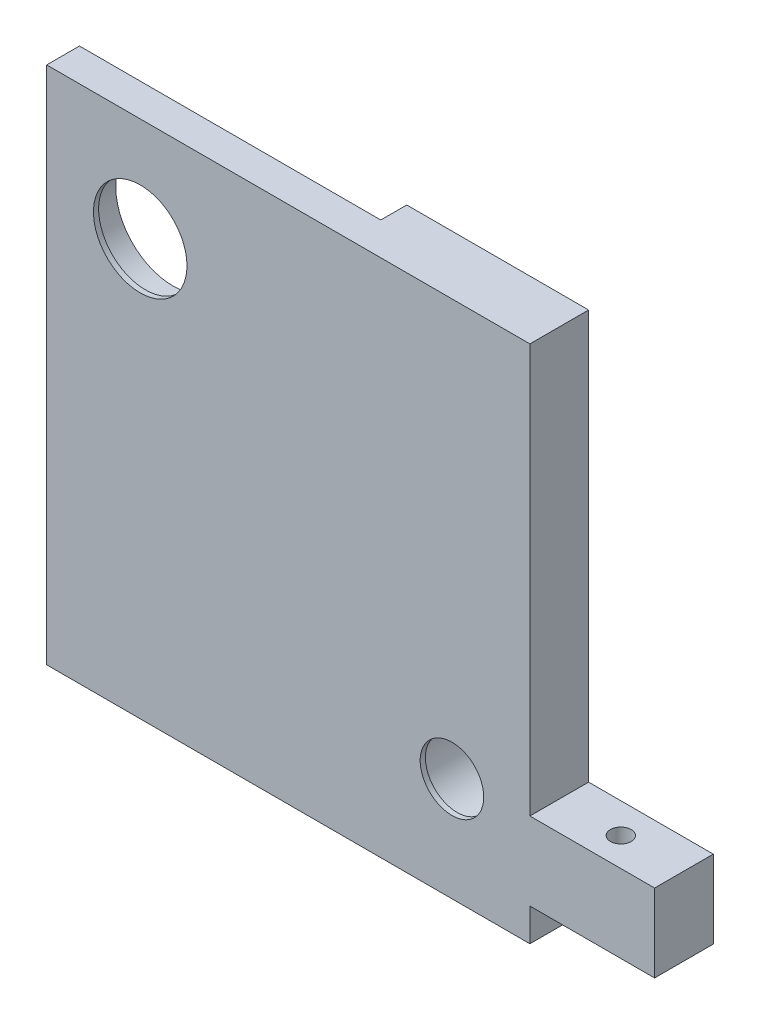
ISO-10303-21;
HEADER;
FILE_DESCRIPTION(('STEP AP214'),'2;1');
FILE_NAME('part.step','',(''),(''),'','','');
FILE_SCHEMA(('AUTOMOTIVE_DESIGN { 1 0 10303 214 1 1 1 1 }'));
ENDSEC;
DATA;
#1=APPLICATION_CONTEXT('core data for automotive mechanical design processes');
#2=APPLICATION_PROTOCOL_DEFINITION('international standard','automotive_design',2000,#1);
#3=PRODUCT_CONTEXT('',#1,'mechanical');
#4=PRODUCT('Part','Part','',(#3));
#5=PRODUCT_RELATED_PRODUCT_CATEGORY('part','',(#4));
#6=PRODUCT_DEFINITION_FORMATION('','',#4);
#7=PRODUCT_DEFINITION_CONTEXT('part definition',#1,'design');
#8=PRODUCT_DEFINITION('design','',#6,#7);
#9=PRODUCT_DEFINITION_SHAPE('','',#8);
#10=(LENGTH_UNIT() NAMED_UNIT(*) SI_UNIT(.MILLI.,.METRE.));
#11=(NAMED_UNIT(*) PLANE_ANGLE_UNIT() SI_UNIT($,.RADIAN.));
#12=(NAMED_UNIT(*) SI_UNIT($,.STERADIAN.) SOLID_ANGLE_UNIT());
#13=UNCERTAINTY_MEASURE_WITH_UNIT(LENGTH_MEASURE(1.E-05),#10,'distance_accuracy_value','');
#14=(GEOMETRIC_REPRESENTATION_CONTEXT(3) GLOBAL_UNCERTAINTY_ASSIGNED_CONTEXT((#13)) GLOBAL_UNIT_ASSIGNED_CONTEXT((#10,
#11,#12)) REPRESENTATION_CONTEXT('',''));
#15=CARTESIAN_POINT('',(0.,0.,0.));
#16=DIRECTION('',(0.,0.,1.));
#17=DIRECTION('',(1.,0.,0.));
#18=AXIS2_PLACEMENT_3D('',#15,#16,#17);
#19=CARTESIAN_POINT('',(1.81294964028778,-15.0719424460432,45.));
#20=DIRECTION('',(0.,0.,-1.));
#21=DIRECTION('',(-1.,0.,0.));
#22=AXIS2_PLACEMENT_3D('',#19,#20,#21);
#23=CYLINDRICAL_SURFACE('',#22,8.115);
#24=CARTESIAN_POINT('',(1.81294964028778,-15.0719424460432,-5.));
#25=DIRECTION('',(0.,0.,-1.));
#26=DIRECTION('',(-1.,0.,0.));
#27=AXIS2_PLACEMENT_3D('',#24,#25,#26);
#28=CIRCLE('',#27,8.115);
#29=CARTESIAN_POINT('',(-6.30205035971223,-15.0719424460432,-5.));
#30=VERTEX_POINT('',#29);
#31=EDGE_CURVE('E287',#30,#30,#28,.T.);
#32=ORIENTED_EDGE('',*,*,#31,.T.);
#33=EDGE_LOOP('',(#32));
#34=FACE_BOUND('',#33,.T.);
#35=CARTESIAN_POINT('',(1.81294964028778,-15.0719424460432,5.3));
#36=DIRECTION('',(0.,0.,1.));
#37=DIRECTION('',(1.,0.,0.));
#38=AXIS2_PLACEMENT_3D('',#35,#36,#37);
#39=CIRCLE('',#38,8.115);
#40=CARTESIAN_POINT('',(9.92794964028778,-15.0719424460432,5.3));
#41=VERTEX_POINT('',#40);
#42=EDGE_CURVE('E12',#41,#41,#39,.F.);
#43=ORIENTED_EDGE('',*,*,#42,.F.);
#44=EDGE_LOOP('',(#43));
#45=FACE_BOUND('',#44,.T.);
#46=ADVANCED_FACE('F45',(#34,#45),#23,.F.);
#47=CARTESIAN_POINT('',(-58.1870503597123,44.9280575539568,50.));
#48=DIRECTION('',(0.,0.,-1.));
#49=DIRECTION('',(-1.,0.,0.));
#50=AXIS2_PLACEMENT_3D('',#47,#48,#49);
#51=CYLINDRICAL_SURFACE('',#50,11.);
#52=CARTESIAN_POINT('',(-58.1870503597123,44.9280575539568,0.));
#53=DIRECTION('',(0.,0.,-1.));
#54=DIRECTION('',(-1.,0.,0.));
#55=AXIS2_PLACEMENT_3D('',#52,#53,#54);
#56=CIRCLE('',#55,11.);
#57=CARTESIAN_POINT('',(-69.1870503597122,44.9280575539568,0.));
#58=VERTEX_POINT('',#57);
#59=EDGE_CURVE('E290',#58,#58,#56,.T.);
#60=ORIENTED_EDGE('',*,*,#59,.T.);
#61=EDGE_LOOP('',(#60));
#62=FACE_BOUND('',#61,.T.);
#63=CARTESIAN_POINT('',(-58.1870503597123,44.9280575539568,5.3));
#64=DIRECTION('',(0.,0.,1.));
#65=DIRECTION('',(1.,0.,0.));
#66=AXIS2_PLACEMENT_3D('',#63,#64,#65);
#67=CIRCLE('',#66,11.);
#68=CARTESIAN_POINT('',(-47.1870503597123,44.9280575539568,5.3));
#69=VERTEX_POINT('',#68);
#70=EDGE_CURVE('E53',#69,#69,#67,.F.);
#71=ORIENTED_EDGE('',*,*,#70,.F.);
#72=EDGE_LOOP('',(#71));
#73=FACE_BOUND('',#72,.T.);
#74=ADVANCED_FACE('F203',(#62,#73),#51,.F.);
#75=CARTESIAN_POINT('',(16.8129496402878,64.9280575539568,6.3));
#76=DIRECTION('',(1.,0.,0.));
#77=DIRECTION('',(0.,1.,0.));
#78=AXIS2_PLACEMENT_3D('',#75,#76,#77);
#79=PLANE('',#78);
#80=DIRECTION('',(0.,0.,1.));
#81=VECTOR('',#80,1.);
#82=CARTESIAN_POINT('',(16.8129496402878,-13.7719424460432,6.3));
#83=LINE('',#82,#81);
#84=CARTESIAN_POINT('',(16.8129496402878,-13.7719424460432,-5.));
#85=VERTEX_POINT('',#84);
#86=CARTESIAN_POINT('',(16.8129496402878,-13.7719424460432,6.3));
#87=VERTEX_POINT('',#86);
#88=EDGE_CURVE('E141',#85,#87,#83,.T.);
#89=ORIENTED_EDGE('',*,*,#88,.F.);
#90=DIRECTION('',(0.,-1.,0.));
#91=VECTOR('',#90,1.);
#92=CARTESIAN_POINT('',(16.8129496402878,64.9280575539568,-5.));
#93=LINE('',#92,#91);
#94=CARTESIAN_POINT('',(16.8129496402878,64.9280575539568,-5.));
#95=VERTEX_POINT('',#94);
#96=EDGE_CURVE('E157',#95,#85,#93,.T.);
#97=ORIENTED_EDGE('',*,*,#96,.F.);
#98=DIRECTION('',(0.,0.,-1.));
#99=VECTOR('',#98,1.);
#100=CARTESIAN_POINT('',(16.8129496402878,64.9280575539568,6.3));
#101=LINE('',#100,#99);
#102=CARTESIAN_POINT('',(16.8129496402878,64.9280575539568,6.3));
#103=VERTEX_POINT('',#102);
#104=EDGE_CURVE('E191',#103,#95,#101,.T.);
#105=ORIENTED_EDGE('',*,*,#104,.F.);
#106=DIRECTION('',(0.,-1.,0.));
#107=VECTOR('',#106,1.);
#108=CARTESIAN_POINT('',(16.8129496402878,64.9280575539568,6.3));
#109=LINE('',#108,#107);
#110=EDGE_CURVE('E68',#103,#87,#109,.T.);
#111=ORIENTED_EDGE('',*,*,#110,.T.);
#112=EDGE_LOOP('',(#89,#97,#105,#111));
#113=FACE_BOUND('',#112,.T.);
#114=ADVANCED_FACE('F205',(#113),#79,.T.);
#115=CARTESIAN_POINT('',(0.,0.,0.));
#116=DIRECTION('',(0.,0.,1.));
#117=DIRECTION('',(1.,0.,0.));
#118=AXIS2_PLACEMENT_3D('',#115,#116,#117);
#119=PLANE('',#118);
#120=ORIENTED_EDGE('',*,*,#59,.F.);
#121=EDGE_LOOP('',(#120));
#122=FACE_BOUND('',#121,.T.);
#123=DIRECTION('',(0.,1.,0.));
#124=VECTOR('',#123,1.);
#125=CARTESIAN_POINT('',(-18.1870503597122,64.9280575539568,0.));
#126=LINE('',#125,#124);
#127=CARTESIAN_POINT('',(-18.1870503597123,-35.0719424460432,0.));
#128=VERTEX_POINT('',#127);
#129=CARTESIAN_POINT('',(-18.1870503597122,64.9280575539568,0.));
#130=VERTEX_POINT('',#129);
#131=EDGE_CURVE('E148',#128,#130,#126,.T.);
#132=ORIENTED_EDGE('',*,*,#131,.F.);
#133=DIRECTION('',(1.,0.,0.));
#134=VECTOR('',#133,1.);
#135=CARTESIAN_POINT('',(-76.1870503597122,-35.0719424460432,0.));
#136=LINE('',#135,#134);
#137=CARTESIAN_POINT('',(-76.1870503597122,-35.0719424460432,0.));
#138=VERTEX_POINT('',#137);
#139=EDGE_CURVE('E186',#138,#128,#136,.T.);
#140=ORIENTED_EDGE('',*,*,#139,.F.);
#141=DIRECTION('',(0.,-1.,0.));
#142=VECTOR('',#141,1.);
#143=CARTESIAN_POINT('',(-76.1870503597122,64.9280575539568,0.));
#144=LINE('',#143,#142);
#145=CARTESIAN_POINT('',(-76.1870503597122,64.9280575539568,0.));
#146=VERTEX_POINT('',#145);
#147=EDGE_CURVE('E173',#146,#138,#144,.T.);
#148=ORIENTED_EDGE('',*,*,#147,.F.);
#149=DIRECTION('',(1.,0.,0.));
#150=VECTOR('',#149,1.);
#151=CARTESIAN_POINT('',(-76.1870503597122,64.9280575539568,0.));
#152=LINE('',#151,#150);
#153=EDGE_CURVE('E177',#146,#130,#152,.T.);
#154=ORIENTED_EDGE('',*,*,#153,.T.);
#155=EDGE_LOOP('',(#132,#140,#148,#154));
#156=FACE_BOUND('',#155,.T.);
#157=ADVANCED_FACE('F212',(#122,#156),#119,.F.);
#158=CARTESIAN_POINT('',(-76.1870503597122,64.9280575539568,6.3));
#159=DIRECTION('',(1.,0.,0.));
#160=DIRECTION('',(0.,0.,-1.));
#161=AXIS2_PLACEMENT_3D('',#158,#159,#160);
#162=PLANE('',#161);
#163=ORIENTED_EDGE('',*,*,#147,.T.);
#164=DIRECTION('',(0.,0.,-1.));
#165=VECTOR('',#164,1.);
#166=CARTESIAN_POINT('',(-76.1870503597122,-35.0719424460432,6.3));
#167=LINE('',#166,#165);
#168=CARTESIAN_POINT('',(-76.1870503597122,-35.0719424460432,6.3));
#169=VERTEX_POINT('',#168);
#170=EDGE_CURVE('E196',#169,#138,#167,.T.);
#171=ORIENTED_EDGE('',*,*,#170,.F.);
#172=DIRECTION('',(0.,-1.,0.));
#173=VECTOR('',#172,1.);
#174=CARTESIAN_POINT('',(-76.1870503597122,64.9280575539568,6.3));
#175=LINE('',#174,#173);
#176=CARTESIAN_POINT('',(-76.1870503597122,64.9280575539568,6.3));
#177=VERTEX_POINT('',#176);
#178=EDGE_CURVE('E174',#177,#169,#175,.T.);
#179=ORIENTED_EDGE('',*,*,#178,.F.);
#180=DIRECTION('',(0.,0.,-1.));
#181=VECTOR('',#180,1.);
#182=CARTESIAN_POINT('',(-76.1870503597122,64.9280575539568,6.3));
#183=LINE('',#182,#181);
#184=EDGE_CURVE('E183',#177,#146,#183,.T.);
#185=ORIENTED_EDGE('',*,*,#184,.T.);
#186=EDGE_LOOP('',(#163,#171,#179,#185));
#187=FACE_BOUND('',#186,.T.);
#188=ADVANCED_FACE('F47',(#187),#162,.F.);
#189=CARTESIAN_POINT('',(-76.1870503597122,-35.0719424460432,6.3));
#190=DIRECTION('',(0.,1.,0.));
#191=DIRECTION('',(0.,0.,1.));
#192=AXIS2_PLACEMENT_3D('',#189,#190,#191);
#193=PLANE('',#192);
#194=ORIENTED_EDGE('',*,*,#139,.T.);
#195=DIRECTION('',(0.,0.,1.));
#196=VECTOR('',#195,1.);
#197=CARTESIAN_POINT('',(-18.1870503597123,-35.0719424460432,-5.));
#198=LINE('',#197,#196);
#199=CARTESIAN_POINT('',(-18.1870503597123,-35.0719424460432,-5.));
#200=VERTEX_POINT('',#199);
#201=EDGE_CURVE('E170',#200,#128,#198,.T.);
#202=ORIENTED_EDGE('',*,*,#201,.F.);
#203=DIRECTION('',(-1.,0.,0.));
#204=VECTOR('',#203,1.);
#205=CARTESIAN_POINT('',(16.8129496402877,-35.0719424460432,-5.));
#206=LINE('',#205,#204);
#207=CARTESIAN_POINT('',(16.8129496402877,-35.0719424460432,-5.));
#208=VERTEX_POINT('',#207);
#209=EDGE_CURVE('E160',#208,#200,#206,.T.);
#210=ORIENTED_EDGE('',*,*,#209,.F.);
#211=DIRECTION('',(0.,0.,-1.));
#212=VECTOR('',#211,1.);
#213=CARTESIAN_POINT('',(16.8129496402878,-35.0719424460432,6.3));
#214=LINE('',#213,#212);
#215=CARTESIAN_POINT('',(16.8129496402878,-35.0719424460432,6.3));
#216=VERTEX_POINT('',#215);
#217=EDGE_CURVE('E193',#216,#208,#214,.T.);
#218=ORIENTED_EDGE('',*,*,#217,.F.);
#219=DIRECTION('',(1.,0.,0.));
#220=VECTOR('',#219,1.);
#221=CARTESIAN_POINT('',(-76.1870503597122,-35.0719424460432,6.3));
#222=LINE('',#221,#220);
#223=EDGE_CURVE('E176',#169,#216,#222,.T.);
#224=ORIENTED_EDGE('',*,*,#223,.F.);
#225=ORIENTED_EDGE('',*,*,#170,.T.);
#226=EDGE_LOOP('',(#194,#202,#210,#218,#224,#225));
#227=FACE_BOUND('',#226,.T.);
#228=ADVANCED_FACE('F251',(#227),#193,.F.);
#229=DIRECTION('',(0.,0.,-1.));
#230=VECTOR('',#229,1.);
#231=CARTESIAN_POINT('',(16.8129496402878,-28.7719424460432,6.3));
#232=LINE('',#231,#230);
#233=CARTESIAN_POINT('',(16.8129496402878,-28.7719424460432,6.3));
#234=VERTEX_POINT('',#233);
#235=CARTESIAN_POINT('',(16.8129496402878,-28.7719424460432,-5.));
#236=VERTEX_POINT('',#235);
#237=EDGE_CURVE('E60',#234,#236,#232,.T.);
#238=ORIENTED_EDGE('',*,*,#237,.F.);
#239=EDGE_CURVE('E147',#234,#216,#109,.T.);
#240=ORIENTED_EDGE('',*,*,#239,.T.);
#241=ORIENTED_EDGE('',*,*,#217,.T.);
#242=EDGE_CURVE('E151',#236,#208,#93,.T.);
#243=ORIENTED_EDGE('',*,*,#242,.F.);
#244=EDGE_LOOP('',(#238,#240,#241,#243));
#245=FACE_BOUND('',#244,.T.);
#246=ADVANCED_FACE('F214',(#245),#79,.T.);
#247=CARTESIAN_POINT('',(-76.1870503597122,64.9280575539568,6.3));
#248=DIRECTION('',(0.,1.,0.));
#249=DIRECTION('',(0.,0.,1.));
#250=AXIS2_PLACEMENT_3D('',#247,#248,#249);
#251=PLANE('',#250);
#252=ORIENTED_EDGE('',*,*,#153,.F.);
#253=ORIENTED_EDGE('',*,*,#184,.F.);
#254=DIRECTION('',(1.,0.,0.));
#255=VECTOR('',#254,1.);
#256=CARTESIAN_POINT('',(-76.1870503597122,64.9280575539568,6.3));
#257=LINE('',#256,#255);
#258=EDGE_CURVE('E180',#177,#103,#257,.T.);
#259=ORIENTED_EDGE('',*,*,#258,.T.);
#260=ORIENTED_EDGE('',*,*,#104,.T.);
#261=DIRECTION('',(1.,0.,0.));
#262=VECTOR('',#261,1.);
#263=CARTESIAN_POINT('',(16.8129496402878,64.9280575539568,-5.));
#264=LINE('',#263,#262);
#265=CARTESIAN_POINT('',(-18.1870503597122,64.9280575539568,-5.));
#266=VERTEX_POINT('',#265);
#267=EDGE_CURVE('E164',#266,#95,#264,.T.);
#268=ORIENTED_EDGE('',*,*,#267,.F.);
#269=DIRECTION('',(0.,0.,1.));
#270=VECTOR('',#269,1.);
#271=CARTESIAN_POINT('',(-18.1870503597122,64.9280575539568,-5.));
#272=LINE('',#271,#270);
#273=EDGE_CURVE('E166',#266,#130,#272,.T.);
#274=ORIENTED_EDGE('',*,*,#273,.T.);
#275=EDGE_LOOP('',(#252,#253,#259,#260,#268,#274));
#276=FACE_BOUND('',#275,.T.);
#277=ADVANCED_FACE('F244',(#276),#251,.T.);
#278=CARTESIAN_POINT('',(0.,0.,6.3));
#279=DIRECTION('',(0.,0.,1.));
#280=DIRECTION('',(1.,0.,0.));
#281=AXIS2_PLACEMENT_3D('',#278,#279,#280);
#282=PLANE('',#281);
#283=ORIENTED_EDGE('',*,*,#178,.T.);
#284=ORIENTED_EDGE('',*,*,#223,.T.);
#285=ORIENTED_EDGE('',*,*,#239,.F.);
#286=DIRECTION('',(-1.,0.,0.));
#287=VECTOR('',#286,1.);
#288=CARTESIAN_POINT('',(40.8129496402878,-28.7719424460432,6.3));
#289=LINE('',#288,#287);
#290=CARTESIAN_POINT('',(40.8129496402878,-28.7719424460432,6.3));
#291=VERTEX_POINT('',#290);
#292=EDGE_CURVE('E126',#291,#234,#289,.T.);
#293=ORIENTED_EDGE('',*,*,#292,.F.);
#294=DIRECTION('',(0.,-1.,0.));
#295=VECTOR('',#294,1.);
#296=CARTESIAN_POINT('',(40.8129496402878,-13.7719424460432,6.3));
#297=LINE('',#296,#295);
#298=CARTESIAN_POINT('',(40.8129496402878,-13.7719424460432,6.3));
#299=VERTEX_POINT('',#298);
#300=EDGE_CURVE('E132',#299,#291,#297,.T.);
#301=ORIENTED_EDGE('',*,*,#300,.F.);
#302=DIRECTION('',(-1.,0.,0.));
#303=VECTOR('',#302,1.);
#304=CARTESIAN_POINT('',(40.8129496402878,-13.7719424460432,6.3));
#305=LINE('',#304,#303);
#306=EDGE_CURVE('E272',#299,#87,#305,.T.);
#307=ORIENTED_EDGE('',*,*,#306,.T.);
#308=ORIENTED_EDGE('',*,*,#110,.F.);
#309=ORIENTED_EDGE('',*,*,#258,.F.);
#310=EDGE_LOOP('',(#283,#284,#285,#293,#301,#307,#308,#309));
#311=FACE_BOUND('',#310,.T.);
#312=CARTESIAN_POINT('',(-58.1870503597123,44.9280575539568,6.3));
#313=DIRECTION('',(0.,0.,1.));
#314=DIRECTION('',(1.,0.,0.));
#315=AXIS2_PLACEMENT_3D('',#312,#313,#314);
#316=CIRCLE('',#315,8.99999999999999);
#317=CARTESIAN_POINT('',(-49.1870503597123,44.9280575539568,6.3));
#318=VERTEX_POINT('',#317);
#319=EDGE_CURVE('E293',#318,#318,#316,.T.);
#320=ORIENTED_EDGE('',*,*,#319,.F.);
#321=EDGE_LOOP('',(#320));
#322=FACE_BOUND('',#321,.T.);
#323=CARTESIAN_POINT('',(1.81294964028778,-15.0719424460432,6.3));
#324=DIRECTION('',(0.,0.,1.));
#325=DIRECTION('',(1.,0.,0.));
#326=AXIS2_PLACEMENT_3D('',#323,#324,#325);
#327=CIRCLE('',#326,6.115);
#328=CARTESIAN_POINT('',(7.92794964028778,-15.0719424460432,6.3));
#329=VERTEX_POINT('',#328);
#330=EDGE_CURVE('E299',#329,#329,#327,.T.);
#331=ORIENTED_EDGE('',*,*,#330,.F.);
#332=EDGE_LOOP('',(#331));
#333=FACE_BOUND('',#332,.T.);
#334=ADVANCED_FACE('F144',(#311,#322,#333),#282,.T.);
#335=CARTESIAN_POINT('',(-18.1870503597122,64.9280575539568,-5.));
#336=DIRECTION('',(1.,0.,0.));
#337=DIRECTION('',(0.,1.,0.));
#338=AXIS2_PLACEMENT_3D('',#335,#336,#337);
#339=PLANE('',#338);
#340=ORIENTED_EDGE('',*,*,#131,.T.);
#341=ORIENTED_EDGE('',*,*,#273,.F.);
#342=DIRECTION('',(0.,1.,0.));
#343=VECTOR('',#342,1.);
#344=CARTESIAN_POINT('',(-18.1870503597122,64.9280575539568,-5.));
#345=LINE('',#344,#343);
#346=EDGE_CURVE('E162',#200,#266,#345,.T.);
#347=ORIENTED_EDGE('',*,*,#346,.F.);
#348=ORIENTED_EDGE('',*,*,#201,.T.);
#349=EDGE_LOOP('',(#340,#341,#347,#348));
#350=FACE_BOUND('',#349,.T.);
#351=ADVANCED_FACE('F237',(#350),#339,.F.);
#352=CARTESIAN_POINT('',(0.,0.,-5.));
#353=DIRECTION('',(0.,0.,-1.));
#354=DIRECTION('',(-1.,0.,0.));
#355=AXIS2_PLACEMENT_3D('',#352,#353,#354);
#356=PLANE('',#355);
#357=ORIENTED_EDGE('',*,*,#31,.F.);
#358=EDGE_LOOP('',(#357));
#359=FACE_BOUND('',#358,.T.);
#360=ORIENTED_EDGE('',*,*,#96,.T.);
#361=DIRECTION('',(-1.,0.,0.));
#362=VECTOR('',#361,1.);
#363=CARTESIAN_POINT('',(40.8129496402878,-13.7719424460432,-5.));
#364=LINE('',#363,#362);
#365=CARTESIAN_POINT('',(40.8129496402878,-13.7719424460432,-5.));
#366=VERTEX_POINT('',#365);
#367=EDGE_CURVE('E153',#366,#85,#364,.T.);
#368=ORIENTED_EDGE('',*,*,#367,.F.);
#369=DIRECTION('',(0.,1.,0.));
#370=VECTOR('',#369,1.);
#371=CARTESIAN_POINT('',(40.8129496402878,-13.7719424460432,-5.));
#372=LINE('',#371,#370);
#373=CARTESIAN_POINT('',(40.8129496402878,-28.7719424460432,-5.));
#374=VERTEX_POINT('',#373);
#375=EDGE_CURVE('E131',#374,#366,#372,.T.);
#376=ORIENTED_EDGE('',*,*,#375,.F.);
#377=DIRECTION('',(-1.,0.,0.));
#378=VECTOR('',#377,1.);
#379=CARTESIAN_POINT('',(40.8129496402878,-28.7719424460432,-5.));
#380=LINE('',#379,#378);
#381=EDGE_CURVE('E128',#374,#236,#380,.T.);
#382=ORIENTED_EDGE('',*,*,#381,.T.);
#383=ORIENTED_EDGE('',*,*,#242,.T.);
#384=ORIENTED_EDGE('',*,*,#209,.T.);
#385=ORIENTED_EDGE('',*,*,#346,.T.);
#386=ORIENTED_EDGE('',*,*,#267,.T.);
#387=EDGE_LOOP('',(#360,#368,#376,#382,#383,#384,#385,#386));
#388=FACE_BOUND('',#387,.T.);
#389=ADVANCED_FACE('F233',(#359,#388),#356,.T.);
#390=CARTESIAN_POINT('',(40.8129496402878,-28.7719424460432,6.3));
#391=DIRECTION('',(0.,1.,0.));
#392=DIRECTION('',(-1.,0.,0.));
#393=AXIS2_PLACEMENT_3D('',#390,#391,#392);
#394=PLANE('',#393);
#395=CARTESIAN_POINT('',(28.8129496402878,-28.7719424460432,0.8));
#396=DIRECTION('',(0.,1.,0.));
#397=DIRECTION('',(-1.,0.,0.));
#398=AXIS2_PLACEMENT_3D('',#395,#396,#397);
#399=CIRCLE('',#398,2.);
#400=CARTESIAN_POINT('',(26.8129496402878,-28.7719424460432,0.8));
#401=VERTEX_POINT('',#400);
#402=EDGE_CURVE('E279',#401,#401,#399,.T.);
#403=ORIENTED_EDGE('',*,*,#402,.T.);
#404=EDGE_LOOP('',(#403));
#405=FACE_BOUND('',#404,.T.);
#406=ORIENTED_EDGE('',*,*,#237,.T.);
#407=ORIENTED_EDGE('',*,*,#381,.F.);
#408=DIRECTION('',(0.,0.,-1.));
#409=VECTOR('',#408,1.);
#410=CARTESIAN_POINT('',(40.8129496402878,-28.7719424460432,6.3));
#411=LINE('',#410,#409);
#412=EDGE_CURVE('E122',#291,#374,#411,.T.);
#413=ORIENTED_EDGE('',*,*,#412,.F.);
#414=ORIENTED_EDGE('',*,*,#292,.T.);
#415=EDGE_LOOP('',(#406,#407,#413,#414));
#416=FACE_BOUND('',#415,.T.);
#417=ADVANCED_FACE('F124',(#405,#416),#394,.F.);
#418=CARTESIAN_POINT('',(40.8129496402878,-13.7719424460432,6.3));
#419=DIRECTION('',(0.,-1.,0.));
#420=DIRECTION('',(1.,0.,0.));
#421=AXIS2_PLACEMENT_3D('',#418,#419,#420);
#422=PLANE('',#421);
#423=CARTESIAN_POINT('',(28.8129496402878,-13.7719424460432,0.8));
#424=DIRECTION('',(0.,1.,0.));
#425=DIRECTION('',(-1.,0.,0.));
#426=AXIS2_PLACEMENT_3D('',#423,#424,#425);
#427=CIRCLE('',#426,2.);
#428=CARTESIAN_POINT('',(26.8129496402878,-13.7719424460432,0.8));
#429=VERTEX_POINT('',#428);
#430=EDGE_CURVE('E284',#429,#429,#427,.T.);
#431=ORIENTED_EDGE('',*,*,#430,.F.);
#432=EDGE_LOOP('',(#431));
#433=FACE_BOUND('',#432,.T.);
#434=ORIENTED_EDGE('',*,*,#88,.T.);
#435=ORIENTED_EDGE('',*,*,#306,.F.);
#436=DIRECTION('',(0.,0.,1.));
#437=VECTOR('',#436,1.);
#438=CARTESIAN_POINT('',(40.8129496402878,-13.7719424460432,6.3));
#439=LINE('',#438,#437);
#440=EDGE_CURVE('E137',#366,#299,#439,.T.);
#441=ORIENTED_EDGE('',*,*,#440,.F.);
#442=ORIENTED_EDGE('',*,*,#367,.T.);
#443=EDGE_LOOP('',(#434,#435,#441,#442));
#444=FACE_BOUND('',#443,.T.);
#445=ADVANCED_FACE('F227',(#433,#444),#422,.F.);
#446=CARTESIAN_POINT('',(40.8129496402878,0.,0.));
#447=DIRECTION('',(1.,0.,0.));
#448=DIRECTION('',(0.,1.,0.));
#449=AXIS2_PLACEMENT_3D('',#446,#447,#448);
#450=PLANE('',#449);
#451=ORIENTED_EDGE('',*,*,#300,.T.);
#452=ORIENTED_EDGE('',*,*,#412,.T.);
#453=ORIENTED_EDGE('',*,*,#375,.T.);
#454=ORIENTED_EDGE('',*,*,#440,.T.);
#455=EDGE_LOOP('',(#451,#452,#453,#454));
#456=FACE_BOUND('',#455,.T.);
#457=ADVANCED_FACE('F135',(#456),#450,.T.);
#458=CARTESIAN_POINT('',(28.8129496402878,-63.7719424460432,0.8));
#459=DIRECTION('',(0.,1.,0.));
#460=DIRECTION('',(-1.,0.,0.));
#461=AXIS2_PLACEMENT_3D('',#458,#459,#460);
#462=CYLINDRICAL_SURFACE('',#461,2.);
#463=ORIENTED_EDGE('',*,*,#430,.T.);
#464=EDGE_LOOP('',(#463));
#465=FACE_BOUND('',#464,.T.);
#466=ORIENTED_EDGE('',*,*,#402,.F.);
#467=EDGE_LOOP('',(#466));
#468=FACE_BOUND('',#467,.T.);
#469=ADVANCED_FACE('F221',(#465,#468),#462,.F.);
#470=CARTESIAN_POINT('',(-58.1870503597123,44.9280575539568,5.3));
#471=DIRECTION('',(0.,0.,1.));
#472=DIRECTION('',(1.,0.,0.));
#473=AXIS2_PLACEMENT_3D('',#470,#471,#472);
#474=PLANE('',#473);
#475=CARTESIAN_POINT('',(-58.1870503597123,44.9280575539568,5.3));
#476=DIRECTION('',(0.,0.,1.));
#477=DIRECTION('',(1.,0.,0.));
#478=AXIS2_PLACEMENT_3D('',#475,#476,#477);
#479=CIRCLE('',#478,8.99999999999999);
#480=CARTESIAN_POINT('',(-49.1870503597123,44.9280575539568,5.3));
#481=VERTEX_POINT('',#480);
#482=EDGE_CURVE('E292',#481,#481,#479,.T.);
#483=ORIENTED_EDGE('',*,*,#482,.T.);
#484=EDGE_LOOP('',(#483));
#485=FACE_BOUND('',#484,.T.);
#486=ORIENTED_EDGE('',*,*,#70,.T.);
#487=EDGE_LOOP('',(#486));
#488=FACE_BOUND('',#487,.T.);
#489=ADVANCED_FACE('F201',(#485,#488),#474,.F.);
#490=CARTESIAN_POINT('',(-58.1870503597123,44.9280575539568,5.3));
#491=DIRECTION('',(0.,0.,1.));
#492=DIRECTION('',(1.,0.,0.));
#493=AXIS2_PLACEMENT_3D('',#490,#491,#492);
#494=CYLINDRICAL_SURFACE('',#493,8.99999999999999);
#495=ORIENTED_EDGE('',*,*,#482,.F.);
#496=EDGE_LOOP('',(#495));
#497=FACE_BOUND('',#496,.T.);
#498=ORIENTED_EDGE('',*,*,#319,.T.);
#499=EDGE_LOOP('',(#498));
#500=FACE_BOUND('',#499,.T.);
#501=ADVANCED_FACE('F317',(#497,#500),#494,.F.);
#502=CARTESIAN_POINT('',(1.81294964028778,-15.0719424460432,5.3));
#503=DIRECTION('',(0.,0.,1.));
#504=DIRECTION('',(1.,0.,0.));
#505=AXIS2_PLACEMENT_3D('',#502,#503,#504);
#506=PLANE('',#505);
#507=CARTESIAN_POINT('',(1.81294964028778,-15.0719424460432,5.3));
#508=DIRECTION('',(0.,0.,1.));
#509=DIRECTION('',(1.,0.,0.));
#510=AXIS2_PLACEMENT_3D('',#507,#508,#509);
#511=CIRCLE('',#510,6.115);
#512=CARTESIAN_POINT('',(7.92794964028778,-15.0719424460432,5.3));
#513=VERTEX_POINT('',#512);
#514=EDGE_CURVE('E296',#513,#513,#511,.T.);
#515=ORIENTED_EDGE('',*,*,#514,.T.);
#516=EDGE_LOOP('',(#515));
#517=FACE_BOUND('',#516,.T.);
#518=ORIENTED_EDGE('',*,*,#42,.T.);
#519=EDGE_LOOP('',(#518));
#520=FACE_BOUND('',#519,.T.);
#521=ADVANCED_FACE('F305',(#517,#520),#506,.F.);
#522=CARTESIAN_POINT('',(1.81294964028778,-15.0719424460432,5.3));
#523=DIRECTION('',(0.,0.,1.));
#524=DIRECTION('',(1.,0.,0.));
#525=AXIS2_PLACEMENT_3D('',#522,#523,#524);
#526=CYLINDRICAL_SURFACE('',#525,6.115);
#527=ORIENTED_EDGE('',*,*,#514,.F.);
#528=EDGE_LOOP('',(#527));
#529=FACE_BOUND('',#528,.T.);
#530=ORIENTED_EDGE('',*,*,#330,.T.);
#531=EDGE_LOOP('',(#530));
#532=FACE_BOUND('',#531,.T.);
#533=ADVANCED_FACE('F308',(#529,#532),#526,.F.);
#534=CLOSED_SHELL('',(#46,#74,#114,#157,#188,#228,#246,#277,#334,#351,#389,#417,#445,#457,#469,
#489,#501,#521,#533));
#535=MANIFOLD_SOLID_BREP('B2',#534);
#536=ADVANCED_BREP_SHAPE_REPRESENTATION('',(#18,#535),#14);
#537=SHAPE_DEFINITION_REPRESENTATION(#9,#536);
ENDSEC;
END-ISO-10303-21;
